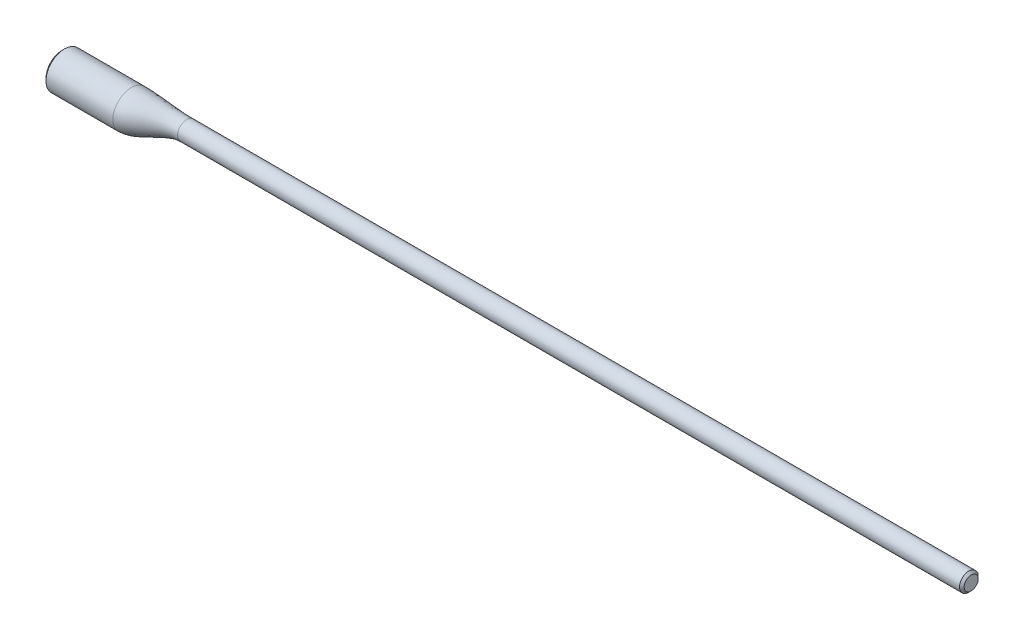
ISO-10303-21;
HEADER;
FILE_DESCRIPTION(('STEP AP214'),'2;1');
FILE_NAME('part.step','',(''),(''),'','','');
FILE_SCHEMA(('AUTOMOTIVE_DESIGN { 1 0 10303 214 1 1 1 1 }'));
ENDSEC;
DATA;
#1=APPLICATION_CONTEXT('core data for automotive mechanical design processes');
#2=APPLICATION_PROTOCOL_DEFINITION('international standard','automotive_design',2000,#1);
#3=PRODUCT_CONTEXT('',#1,'mechanical');
#4=PRODUCT('Part','Part','',(#3));
#5=PRODUCT_RELATED_PRODUCT_CATEGORY('part','',(#4));
#6=PRODUCT_DEFINITION_FORMATION('','',#4);
#7=PRODUCT_DEFINITION_CONTEXT('part definition',#1,'design');
#8=PRODUCT_DEFINITION('design','',#6,#7);
#9=PRODUCT_DEFINITION_SHAPE('','',#8);
#10=(LENGTH_UNIT() NAMED_UNIT(*) SI_UNIT(.MILLI.,.METRE.));
#11=(NAMED_UNIT(*) PLANE_ANGLE_UNIT() SI_UNIT($,.RADIAN.));
#12=(NAMED_UNIT(*) SI_UNIT($,.STERADIAN.) SOLID_ANGLE_UNIT());
#13=UNCERTAINTY_MEASURE_WITH_UNIT(LENGTH_MEASURE(1.E-05),#10,'distance_accuracy_value','');
#14=(GEOMETRIC_REPRESENTATION_CONTEXT(3) GLOBAL_UNCERTAINTY_ASSIGNED_CONTEXT((#13)) GLOBAL_UNIT_ASSIGNED_CONTEXT((#10,
#11,#12)) REPRESENTATION_CONTEXT('',''));
#15=CARTESIAN_POINT('',(0.,0.,0.));
#16=DIRECTION('',(0.,0.,1.));
#17=DIRECTION('',(1.,0.,0.));
#18=AXIS2_PLACEMENT_3D('',#15,#16,#17);
#19=CARTESIAN_POINT('',(180.,-1.28557521937308,0.467911113762047));
#20=DIRECTION('',(0.,0.642787609686541,0.766044443118976));
#21=DIRECTION('',(0.,-0.766044443118977,0.642787609686541));
#22=AXIS2_PLACEMENT_3D('',#19,#20,#21);
#23=PLANE('',#22);
#24=DIRECTION('',(-1.,0.,0.));
#25=VECTOR('',#24,1.);
#26=CARTESIAN_POINT('',(180.,-0.727940468532405,0.));
#27=LINE('',#26,#25);
#28=CARTESIAN_POINT('',(179.5,-0.727940468532405,0.));
#29=VERTEX_POINT('',#28);
#30=CARTESIAN_POINT('',(10.,-0.727940468532405,0.));
#31=VERTEX_POINT('',#30);
#32=EDGE_CURVE('E500',#29,#31,#27,.T.);
#33=ORIENTED_EDGE('',*,*,#32,.F.);
#34=DIRECTION('',(0.,-0.766044443118977,0.642787609686541));
#35=VECTOR('',#34,1.);
#36=CARTESIAN_POINT('',(179.5,-1.28557521937308,0.467911113762048));
#37=LINE('',#36,#35);
#38=CARTESIAN_POINT('',(179.5,-1.28557521937308,0.467911113762048));
#39=VERTEX_POINT('',#38);
#40=EDGE_CURVE('E258',#29,#39,#37,.T.);
#41=ORIENTED_EDGE('',*,*,#40,.T.);
#42=DIRECTION('',(-1.,0.,0.));
#43=VECTOR('',#42,1.);
#44=CARTESIAN_POINT('',(180.,-1.28557521937308,0.467911113762048));
#45=LINE('',#44,#43);
#46=CARTESIAN_POINT('',(10.,-1.28557521937308,0.467911113762048));
#47=VERTEX_POINT('',#46);
#48=EDGE_CURVE('E254',#39,#47,#45,.T.);
#49=ORIENTED_EDGE('',*,*,#48,.T.);
#50=DIRECTION('',(0.,0.766044443118977,-0.642787609686541));
#51=VECTOR('',#50,1.);
#52=CARTESIAN_POINT('',(10.,-1.28557521937308,0.467911113762048));
#53=LINE('',#52,#51);
#54=EDGE_CURVE('E259',#47,#31,#53,.T.);
#55=ORIENTED_EDGE('',*,*,#54,.T.);
#56=EDGE_LOOP('',(#33,#41,#49,#55));
#57=FACE_BOUND('',#56,.T.);
#58=ADVANCED_FACE('F158',(#57),#23,.F.);
#59=CARTESIAN_POINT('',(180.,-0.727940468532405,0.));
#60=DIRECTION('',(0.,0.,1.));
#61=DIRECTION('',(1.,0.,0.));
#62=AXIS2_PLACEMENT_3D('',#59,#60,#61);
#63=PLANE('',#62);
#64=DIRECTION('',(-1.,0.,0.));
#65=VECTOR('',#64,1.);
#66=CARTESIAN_POINT('',(180.,0.727940468532405,0.));
#67=LINE('',#66,#65);
#68=CARTESIAN_POINT('',(179.5,0.727940468532405,0.));
#69=VERTEX_POINT('',#68);
#70=CARTESIAN_POINT('',(10.,0.727940468532405,0.));
#71=VERTEX_POINT('',#70);
#72=EDGE_CURVE('E509',#69,#71,#67,.T.);
#73=ORIENTED_EDGE('',*,*,#72,.F.);
#74=DIRECTION('',(0.,-1.,0.));
#75=VECTOR('',#74,1.);
#76=CARTESIAN_POINT('',(179.5,-0.727940468532405,0.));
#77=LINE('',#76,#75);
#78=EDGE_CURVE('E528',#69,#29,#77,.T.);
#79=ORIENTED_EDGE('',*,*,#78,.T.);
#80=ORIENTED_EDGE('',*,*,#32,.T.);
#81=CARTESIAN_POINT('',(10.,-0.727940468532405,0.));
#82=CARTESIAN_POINT('',(6.6578467133078,-0.727940468532405,0.));
#83=CARTESIAN_POINT('',(3.3421532866922,-1.45588093706482,0.));
#84=CARTESIAN_POINT('',(0.,-1.45588093706482,0.));
#85=B_SPLINE_CURVE_WITH_KNOTS('',3,(#81,#82,#83,#84),.UNSPECIFIED.,.F.,.F.,(4,4),(0.,1.),.UNSPECIFIED.);
#86=CARTESIAN_POINT('',(0.,-1.45588093706482,0.));
#87=VERTEX_POINT('',#86);
#88=EDGE_CURVE('E278',#87,#31,#85,.F.);
#89=ORIENTED_EDGE('',*,*,#88,.F.);
#90=DIRECTION('',(1.,0.,0.));
#91=VECTOR('',#90,1.);
#92=CARTESIAN_POINT('',(-15.,-1.45588093706482,0.));
#93=LINE('',#92,#91);
#94=CARTESIAN_POINT('',(-14.5,-1.45588093706482,0.));
#95=VERTEX_POINT('',#94);
#96=EDGE_CURVE('E435',#95,#87,#93,.T.);
#97=ORIENTED_EDGE('',*,*,#96,.F.);
#98=DIRECTION('',(0.,1.,0.));
#99=VECTOR('',#98,1.);
#100=CARTESIAN_POINT('',(-14.5,1.45588093706482,0.));
#101=LINE('',#100,#99);
#102=CARTESIAN_POINT('',(-14.5,1.45588093706482,0.));
#103=VERTEX_POINT('',#102);
#104=EDGE_CURVE('E474',#95,#103,#101,.T.);
#105=ORIENTED_EDGE('',*,*,#104,.T.);
#106=DIRECTION('',(1.,0.,0.));
#107=VECTOR('',#106,1.);
#108=CARTESIAN_POINT('',(-15.,1.45588093706482,0.));
#109=LINE('',#108,#107);
#110=CARTESIAN_POINT('',(0.,1.45588093706482,0.));
#111=VERTEX_POINT('',#110);
#112=EDGE_CURVE('E266',#103,#111,#109,.T.);
#113=ORIENTED_EDGE('',*,*,#112,.T.);
#114=CARTESIAN_POINT('',(10.,0.727940468532405,0.));
#115=CARTESIAN_POINT('',(6.6578467133078,0.727940468532405,0.));
#116=CARTESIAN_POINT('',(3.3421532866922,1.45588093706482,0.));
#117=CARTESIAN_POINT('',(0.,1.45588093706482,0.));
#118=B_SPLINE_CURVE_WITH_KNOTS('',3,(#114,#115,#116,#117),.UNSPECIFIED.,.F.,.F.,(4,4),(0.,1.),.UNSPECIFIED.);
#119=EDGE_CURVE('E488',#71,#111,#118,.T.);
#120=ORIENTED_EDGE('',*,*,#119,.F.);
#121=EDGE_LOOP('',(#73,#79,#80,#89,#97,#105,#113,#120));
#122=FACE_BOUND('',#121,.T.);
#123=ADVANCED_FACE('F314',(#122),#63,.F.);
#124=CARTESIAN_POINT('',(180.,0.727940468532405,0.));
#125=DIRECTION('',(0.,-0.642787609686541,0.766044443118976));
#126=DIRECTION('',(0.,-0.766044443118976,-0.642787609686541));
#127=AXIS2_PLACEMENT_3D('',#124,#125,#126);
#128=PLANE('',#127);
#129=DIRECTION('',(-1.,0.,0.));
#130=VECTOR('',#129,1.);
#131=CARTESIAN_POINT('',(180.,1.28557521937308,0.467911113762047));
#132=LINE('',#131,#130);
#133=CARTESIAN_POINT('',(179.5,1.28557521937308,0.467911113762047));
#134=VERTEX_POINT('',#133);
#135=CARTESIAN_POINT('',(10.0000000000001,1.28557521937308,0.467911113762047));
#136=VERTEX_POINT('',#135);
#137=EDGE_CURVE('E264',#134,#136,#132,.T.);
#138=ORIENTED_EDGE('',*,*,#137,.F.);
#139=DIRECTION('',(0.,-0.766044443118976,-0.642787609686541));
#140=VECTOR('',#139,1.);
#141=CARTESIAN_POINT('',(179.5,0.727940468532405,0.));
#142=LINE('',#141,#140);
#143=EDGE_CURVE('E525',#134,#69,#142,.T.);
#144=ORIENTED_EDGE('',*,*,#143,.T.);
#145=ORIENTED_EDGE('',*,*,#72,.T.);
#146=DIRECTION('',(0.,0.766044443118976,0.642787609686541));
#147=VECTOR('',#146,1.);
#148=CARTESIAN_POINT('',(10.,0.727940468532405,0.));
#149=LINE('',#148,#147);
#150=EDGE_CURVE('E283',#71,#136,#149,.T.);
#151=ORIENTED_EDGE('',*,*,#150,.T.);
#152=EDGE_LOOP('',(#138,#144,#145,#151));
#153=FACE_BOUND('',#152,.T.);
#154=ADVANCED_FACE('F309',(#153),#128,.F.);
#155=CARTESIAN_POINT('',(180.,0.,2.));
#156=DIRECTION('',(-1.,0.,0.));
#157=DIRECTION('',(0.,0.,1.));
#158=AXIS2_PLACEMENT_3D('',#155,#156,#157);
#159=CYLINDRICAL_SURFACE('',#158,2.);
#160=ORIENTED_EDGE('',*,*,#48,.F.);
#161=CARTESIAN_POINT('',(179.5,0.,2.));
#162=DIRECTION('',(1.,0.,0.));
#163=DIRECTION('',(0.,0.,-1.));
#164=AXIS2_PLACEMENT_3D('',#161,#162,#163);
#165=CIRCLE('',#164,2.);
#166=EDGE_CURVE('E510',#39,#134,#165,.F.);
#167=ORIENTED_EDGE('',*,*,#166,.T.);
#168=ORIENTED_EDGE('',*,*,#137,.T.);
#169=CARTESIAN_POINT('',(10.,0.,2.));
#170=DIRECTION('',(1.,0.,0.));
#171=DIRECTION('',(0.,0.,-1.));
#172=AXIS2_PLACEMENT_3D('',#169,#170,#171);
#173=CIRCLE('',#172,2.);
#174=EDGE_CURVE('E274',#136,#47,#173,.T.);
#175=ORIENTED_EDGE('',*,*,#174,.T.);
#176=EDGE_LOOP('',(#160,#167,#168,#175));
#177=FACE_BOUND('',#176,.T.);
#178=ADVANCED_FACE('F287',(#177),#159,.T.);
#179=CARTESIAN_POINT('',(180.,0.,2.));
#180=DIRECTION('',(1.,0.,0.));
#181=DIRECTION('',(0.,0.,-1.));
#182=AXIS2_PLACEMENT_3D('',#179,#180,#181);
#183=PLANE('',#182);
#184=DIRECTION('',(0.,0.766044443118976,0.642787609686541));
#185=VECTOR('',#184,1.);
#186=CARTESIAN_POINT('',(180.,0.964181414529798,0.850933335321548));
#187=LINE('',#186,#185);
#188=CARTESIAN_POINT('',(180.,0.545955351399297,0.500000000000017));
#189=VERTEX_POINT('',#188);
#190=CARTESIAN_POINT('',(180.,0.964181414529799,0.850933335321548));
#191=VERTEX_POINT('',#190);
#192=EDGE_CURVE('E499',#189,#191,#187,.T.);
#193=ORIENTED_EDGE('',*,*,#192,.T.);
#194=CARTESIAN_POINT('',(180.,0.,2.));
#195=DIRECTION('',(1.,0.,0.));
#196=DIRECTION('',(0.,0.,-1.));
#197=AXIS2_PLACEMENT_3D('',#194,#195,#196);
#198=CIRCLE('',#197,1.49999999999998);
#199=CARTESIAN_POINT('',(180.,-0.964181414529799,0.85093333532155));
#200=VERTEX_POINT('',#199);
#201=EDGE_CURVE('E503',#191,#200,#198,.T.);
#202=ORIENTED_EDGE('',*,*,#201,.T.);
#203=DIRECTION('',(0.,0.766044443118977,-0.642787609686541));
#204=VECTOR('',#203,1.);
#205=CARTESIAN_POINT('',(180.,-0.406546663689123,0.383022221559501));
#206=LINE('',#205,#204);
#207=CARTESIAN_POINT('',(180.,-0.545955351399296,0.500000000000017));
#208=VERTEX_POINT('',#207);
#209=EDGE_CURVE('E491',#200,#208,#206,.T.);
#210=ORIENTED_EDGE('',*,*,#209,.T.);
#211=DIRECTION('',(0.,1.,0.));
#212=VECTOR('',#211,1.);
#213=CARTESIAN_POINT('',(180.,0.727940468532405,0.500000000000017));
#214=LINE('',#213,#212);
#215=EDGE_CURVE('E496',#208,#189,#214,.T.);
#216=ORIENTED_EDGE('',*,*,#215,.T.);
#217=EDGE_LOOP('',(#193,#202,#210,#216));
#218=FACE_BOUND('',#217,.T.);
#219=ADVANCED_FACE('F307',(#218),#183,.T.);
#220=CARTESIAN_POINT('',(-15.,2.57115043874617,0.935822227524095));
#221=DIRECTION('',(0.,-0.642787609686542,0.766044443118976));
#222=DIRECTION('',(0.,-0.766044443118976,-0.642787609686542));
#223=AXIS2_PLACEMENT_3D('',#220,#221,#222);
#224=PLANE('',#223);
#225=ORIENTED_EDGE('',*,*,#112,.F.);
#226=DIRECTION('',(0.,0.766044443118976,0.642787609686542));
#227=VECTOR('',#226,1.);
#228=CARTESIAN_POINT('',(-14.5,2.57115043874617,0.935822227524096));
#229=LINE('',#228,#227);
#230=CARTESIAN_POINT('',(-14.5,2.57115043874617,0.935822227524095));
#231=VERTEX_POINT('',#230);
#232=EDGE_CURVE('E12',#103,#231,#229,.T.);
#233=ORIENTED_EDGE('',*,*,#232,.T.);
#234=DIRECTION('',(1.,0.,0.));
#235=VECTOR('',#234,1.);
#236=CARTESIAN_POINT('',(-15.,2.57115043874617,0.935822227524095));
#237=LINE('',#236,#235);
#238=CARTESIAN_POINT('',(0.,2.57115043874617,0.935822227524095));
#239=VERTEX_POINT('',#238);
#240=EDGE_CURVE('E433',#231,#239,#237,.T.);
#241=ORIENTED_EDGE('',*,*,#240,.T.);
#242=DIRECTION('',(0.,-0.766044443118976,-0.642787609686542));
#243=VECTOR('',#242,1.);
#244=CARTESIAN_POINT('',(0.,2.57115043874617,0.935822227524095));
#245=LINE('',#244,#243);
#246=EDGE_CURVE('E467',#239,#111,#245,.T.);
#247=ORIENTED_EDGE('',*,*,#246,.T.);
#248=EDGE_LOOP('',(#225,#233,#241,#247));
#249=FACE_BOUND('',#248,.T.);
#250=ADVANCED_FACE('F456',(#249),#224,.F.);
#251=CARTESIAN_POINT('',(-15.,-1.45588093706482,0.));
#252=DIRECTION('',(0.,0.642787609686542,0.766044443118976));
#253=DIRECTION('',(0.,-0.766044443118976,0.642787609686542));
#254=AXIS2_PLACEMENT_3D('',#251,#252,#253);
#255=PLANE('',#254);
#256=DIRECTION('',(1.,0.,0.));
#257=VECTOR('',#256,1.);
#258=CARTESIAN_POINT('',(-15.,-2.57115043874617,0.935822227524095));
#259=LINE('',#258,#257);
#260=CARTESIAN_POINT('',(-14.5,-2.57115043874617,0.935822227524095));
#261=VERTEX_POINT('',#260);
#262=CARTESIAN_POINT('',(0.,-2.57115043874617,0.935822227524095));
#263=VERTEX_POINT('',#262);
#264=EDGE_CURVE('E429',#261,#263,#259,.T.);
#265=ORIENTED_EDGE('',*,*,#264,.F.);
#266=DIRECTION('',(0.,0.766044443118976,-0.642787609686542));
#267=VECTOR('',#266,1.);
#268=CARTESIAN_POINT('',(-14.5,-1.45588093706482,0.));
#269=LINE('',#268,#267);
#270=EDGE_CURVE('E167',#261,#95,#269,.T.);
#271=ORIENTED_EDGE('',*,*,#270,.T.);
#272=ORIENTED_EDGE('',*,*,#96,.T.);
#273=DIRECTION('',(0.,-0.766044443118976,0.642787609686542));
#274=VECTOR('',#273,1.);
#275=CARTESIAN_POINT('',(0.,-1.45588093706482,0.));
#276=LINE('',#275,#274);
#277=EDGE_CURVE('E479',#87,#263,#276,.T.);
#278=ORIENTED_EDGE('',*,*,#277,.T.);
#279=EDGE_LOOP('',(#265,#271,#272,#278));
#280=FACE_BOUND('',#279,.T.);
#281=ADVANCED_FACE('F453',(#280),#255,.F.);
#282=CARTESIAN_POINT('',(-15.,0.,4.));
#283=DIRECTION('',(1.,0.,0.));
#284=DIRECTION('',(0.,0.,-1.));
#285=AXIS2_PLACEMENT_3D('',#282,#283,#284);
#286=CYLINDRICAL_SURFACE('',#285,4.);
#287=ORIENTED_EDGE('',*,*,#240,.F.);
#288=CARTESIAN_POINT('',(-14.5,0.,4.));
#289=DIRECTION('',(-1.,0.,0.));
#290=DIRECTION('',(0.,0.,1.));
#291=AXIS2_PLACEMENT_3D('',#288,#289,#290);
#292=CIRCLE('',#291,4.);
#293=EDGE_CURVE('E424',#231,#261,#292,.F.);
#294=ORIENTED_EDGE('',*,*,#293,.T.);
#295=ORIENTED_EDGE('',*,*,#264,.T.);
#296=CARTESIAN_POINT('',(0.,1.45588093706482,0.));
#297=CARTESIAN_POINT('',(0.,1.54882006220493,0.0779851856270084));
#298=CARTESIAN_POINT('',(0.,1.73469831248515,0.233955556881025));
#299=CARTESIAN_POINT('',(0.,2.01351568790549,0.467911113762048));
#300=CARTESIAN_POINT('',(0.,2.29233306332583,0.701866670643072));
#301=CARTESIAN_POINT('',(0.,2.47821131360605,0.857837041897087));
#302=CARTESIAN_POINT('',(0.,2.88311705075017,1.19759329659628));
#303=CARTESIAN_POINT('',(0.,3.42494230375342,1.81750567178898));
#304=CARTESIAN_POINT('',(0.,4.09345487548263,3.32497957238402));
#305=CARTESIAN_POINT('',(0.,4.00097886537138,5.45588692398781));
#306=CARTESIAN_POINT('',(0.,2.4418978116345,7.48757836550999));
#307=CARTESIAN_POINT('',(0.,0.,8.25733863000625));
#308=CARTESIAN_POINT('',(0.,-2.44189781163452,7.48757836550999));
#309=CARTESIAN_POINT('',(0.,-4.00097886537135,5.45588692398781));
#310=CARTESIAN_POINT('',(0.,-4.09345487548265,3.32497957238403));
#311=CARTESIAN_POINT('',(0.,-3.42494230375341,1.81750567178898));
#312=CARTESIAN_POINT('',(0.,-2.88311705075017,1.19759329659628));
#313=CARTESIAN_POINT('',(0.,-2.47821131360605,0.857837041897087));
#314=CARTESIAN_POINT('',(0.,-2.29233306332583,0.701866670643071));
#315=CARTESIAN_POINT('',(0.,-2.01351568790549,0.467911113762047));
#316=CARTESIAN_POINT('',(0.,-1.73469831248516,0.233955556881024));
#317=CARTESIAN_POINT('',(0.,-1.54882006220493,0.077985185627008));
#318=CARTESIAN_POINT('',(0.,-1.45588093706482,0.));
#319=B_SPLINE_CURVE_WITH_KNOTS('',3,(#296,#297,#298,#299,#300,#301,#302,#303,#304,#305,#306,
#307,#308,#309,#310,#311,#312,#313,#314,#315,#316,#317,#318),.UNSPECIFIED.,.F.,.F.,(4,1,1,1,2,1,
1,1,1,1,1,1,1,1,2,1,1,1,4),(0.,0.0162056614220876,0.032411322844175,0.0486169842662625,
0.0648226456883501,0.119219814977306,0.173616984266262,0.282411322844175,0.391205661422088,0.5,
0.608794338577912,0.717588677155825,0.826383015733737,0.880780185022694,0.93517735431165,
0.951383015733737,0.967588677155825,0.983794338577912,1.),.UNSPECIFIED.);
#320=EDGE_CURVE('E482',#263,#239,#319,.F.);
#321=ORIENTED_EDGE('',*,*,#320,.T.);
#322=EDGE_LOOP('',(#287,#294,#295,#321));
#323=FACE_BOUND('',#322,.T.);
#324=ADVANCED_FACE('F442',(#323),#286,.T.);
#325=CARTESIAN_POINT('',(-15.,0.,4.));
#326=DIRECTION('',(-1.,0.,0.));
#327=DIRECTION('',(0.,0.,1.));
#328=AXIS2_PLACEMENT_3D('',#325,#326,#327);
#329=PLANE('',#328);
#330=DIRECTION('',(0.,-0.766044443118976,0.642787609686542));
#331=VECTOR('',#330,1.);
#332=CARTESIAN_POINT('',(-15.,-2.24975663390293,1.31884444908354));
#333=LINE('',#332,#331);
#334=CARTESIAN_POINT('',(-15.,-1.27389581993173,0.499999999999948));
#335=VERTEX_POINT('',#334);
#336=CARTESIAN_POINT('',(-15.,-2.24975663390293,1.31884444908354));
#337=VERTEX_POINT('',#336);
#338=EDGE_CURVE('E395',#335,#337,#333,.T.);
#339=ORIENTED_EDGE('',*,*,#338,.T.);
#340=CARTESIAN_POINT('',(-15.,0.,4.));
#341=DIRECTION('',(-1.,0.,0.));
#342=DIRECTION('',(0.,0.,1.));
#343=AXIS2_PLACEMENT_3D('',#340,#341,#342);
#344=CIRCLE('',#343,3.50000000000005);
#345=CARTESIAN_POINT('',(-15.,2.24975663390293,1.31884444908354));
#346=VERTEX_POINT('',#345);
#347=EDGE_CURVE('E426',#337,#346,#344,.T.);
#348=ORIENTED_EDGE('',*,*,#347,.T.);
#349=DIRECTION('',(0.,-0.766044443118976,-0.642787609686542));
#350=VECTOR('',#349,1.);
#351=CARTESIAN_POINT('',(-15.,1.13448713222158,0.383022221559448));
#352=LINE('',#351,#350);
#353=CARTESIAN_POINT('',(-15.,1.27389581993173,0.499999999999948));
#354=VERTEX_POINT('',#353);
#355=EDGE_CURVE('E473',#346,#354,#352,.T.);
#356=ORIENTED_EDGE('',*,*,#355,.T.);
#357=DIRECTION('',(0.,-1.,0.));
#358=VECTOR('',#357,1.);
#359=CARTESIAN_POINT('',(-15.,-1.45588093706482,0.499999999999948));
#360=LINE('',#359,#358);
#361=EDGE_CURVE('E471',#354,#335,#360,.T.);
#362=ORIENTED_EDGE('',*,*,#361,.T.);
#363=EDGE_LOOP('',(#339,#348,#356,#362));
#364=FACE_BOUND('',#363,.T.);
#365=ADVANCED_FACE('F455',(#364),#329,.T.);
#366=CARTESIAN_POINT('',(10.,-0.727940468532405,0.));
#367=CARTESIAN_POINT('',(6.6578467133078,-0.727940468532405,0.));
#368=CARTESIAN_POINT('',(3.3421532866922,-1.45588093706482,0.));
#369=CARTESIAN_POINT('',(0.,-1.45588093706482,0.));
#370=CARTESIAN_POINT('',(10.,-0.774410031102461,0.0389925928135041));
#371=CARTESIAN_POINT('',(6.65661668693848,-0.774410031102461,0.0389925928135041));
#372=CARTESIAN_POINT('',(3.34338331306153,-1.54882006220493,0.077985185627008));
#373=CARTESIAN_POINT('',(0.,-1.54882006220493,0.077985185627008));
#374=CARTESIAN_POINT('',(10.,-0.867349156242575,0.116977778440512));
#375=CARTESIAN_POINT('',(6.65415663419982,-0.867349156242575,0.116977778440512));
#376=CARTESIAN_POINT('',(3.34584336580019,-1.73469831248515,0.233955556881024));
#377=CARTESIAN_POINT('',(0.,-1.73469831248516,0.233955556881024));
#378=CARTESIAN_POINT('',(10.,-1.00675784395274,0.233955556881024));
#379=CARTESIAN_POINT('',(6.6490750355602,-1.00675784395274,0.233955556881024));
#380=CARTESIAN_POINT('',(3.3509249644398,-2.01351568790549,0.467911113762047));
#381=CARTESIAN_POINT('',(0.,-2.01351568790549,0.467911113762047));
#382=CARTESIAN_POINT('',(10.,-1.14616653166291,0.350933335321536));
#383=CARTESIAN_POINT('',(6.64299736814644,-1.14616653166291,0.350933335321536));
#384=CARTESIAN_POINT('',(3.35700263185357,-2.29233306332583,0.701866670643072));
#385=CARTESIAN_POINT('',(0.,-2.29233306332583,0.701866670643071));
#386=CARTESIAN_POINT('',(10.,-1.23910565680302,0.428918520948544));
#387=CARTESIAN_POINT('',(6.63817429619333,-1.23910565680302,0.428918520948544));
#388=CARTESIAN_POINT('',(3.36182570380668,-2.47821131360605,0.857837041897087));
#389=CARTESIAN_POINT('',(0.,-2.47821131360605,0.857837041897087));
#390=CARTESIAN_POINT('',(10.,-1.44155852537508,0.598796648298142));
#391=CARTESIAN_POINT('',(6.62703386652991,-1.44155852537508,0.598796648298142));
#392=CARTESIAN_POINT('',(3.3729661334701,-2.88311705075017,1.19759329659628));
#393=CARTESIAN_POINT('',(0.,-2.88311705075017,1.19759329659628));
#394=CARTESIAN_POINT('',(9.99999999999999,-1.71222678129943,0.909411513453149));
#395=CARTESIAN_POINT('',(6.60658712192478,-1.71222678129943,0.909411513453149));
#396=CARTESIAN_POINT('',(3.3934128780752,-3.42494230375341,1.81750567178898));
#397=CARTESIAN_POINT('',(0.,-3.42494230375341,1.81750567178898));
#398=CARTESIAN_POINT('',(9.99999999999998,-2.04695818154675,1.66188115126264));
#399=CARTESIAN_POINT('',(6.55738864332492,-2.04695818154675,1.66188115126264));
#400=CARTESIAN_POINT('',(3.44261135667506,-4.09345487548265,3.32497957238403));
#401=CARTESIAN_POINT('',(0.,-4.09345487548265,3.32497957238403));
#402=CARTESIAN_POINT('',(10.,-2.00034093394808,2.72828938102637));
#403=CARTESIAN_POINT('',(6.48921785599439,-2.00034093394808,2.72828938102637));
#404=CARTESIAN_POINT('',(3.51078214400564,-4.00097886537135,5.45588692398781));
#405=CARTESIAN_POINT('',(0.,-4.00097886537135,5.45588692398781));
#406=CARTESIAN_POINT('',(9.99999999999997,-1.22099565928668,3.7436730401692));
#407=CARTESIAN_POINT('',(6.42566683012112,-1.22099565928668,3.7436730401692));
#408=CARTESIAN_POINT('',(3.57433316987886,-2.44189781163452,7.48757836550999));
#409=CARTESIAN_POINT('',(0.,-2.44189781163452,7.48757836550999));
#410=CARTESIAN_POINT('',(10.,0.,4.12880799300756));
#411=CARTESIAN_POINT('',(6.40194194473065,0.,4.12880799300756));
#412=CARTESIAN_POINT('',(3.59805805526937,0.,8.25733863000625));
#413=CARTESIAN_POINT('',(0.,0.,8.25733863000625));
#414=CARTESIAN_POINT('',(9.99999999999999,1.22099565928669,3.7436730401692));
#415=CARTESIAN_POINT('',(6.42566683012113,1.22099565928669,3.7436730401692));
#416=CARTESIAN_POINT('',(3.57433316987886,2.4418978116345,7.48757836550999));
#417=CARTESIAN_POINT('',(0.,2.4418978116345,7.48757836550999));
#418=CARTESIAN_POINT('',(9.99999999999999,2.00034093394808,2.72828938102637));
#419=CARTESIAN_POINT('',(6.48921785599437,2.00034093394808,2.72828938102637));
#420=CARTESIAN_POINT('',(3.51078214400563,4.00097886537138,5.45588692398781));
#421=CARTESIAN_POINT('',(0.,4.00097886537138,5.45588692398781));
#422=CARTESIAN_POINT('',(10.,2.04695818154675,1.66188115126263));
#423=CARTESIAN_POINT('',(6.55738864332493,2.04695818154675,1.66188115126263));
#424=CARTESIAN_POINT('',(3.44261135667507,4.09345487548263,3.32497957238402));
#425=CARTESIAN_POINT('',(0.,4.09345487548263,3.32497957238402));
#426=CARTESIAN_POINT('',(10.,1.71222678129943,0.909411513453147));
#427=CARTESIAN_POINT('',(6.60658712192481,1.71222678129943,0.909411513453147));
#428=CARTESIAN_POINT('',(3.39341287807521,3.42494230375342,1.81750567178898));
#429=CARTESIAN_POINT('',(0.,3.42494230375342,1.81750567178898));
#430=CARTESIAN_POINT('',(10.,1.44155852537508,0.59879664829814));
#431=CARTESIAN_POINT('',(6.62703386652991,1.44155852537508,0.59879664829814));
#432=CARTESIAN_POINT('',(3.37296613347011,2.88311705075017,1.19759329659628));
#433=CARTESIAN_POINT('',(0.,2.88311705075017,1.19759329659628));
#434=CARTESIAN_POINT('',(10.,1.23910565680302,0.428918520948543));
#435=CARTESIAN_POINT('',(6.63817429619333,1.23910565680302,0.428918520948543));
#436=CARTESIAN_POINT('',(3.36182570380668,2.47821131360605,0.857837041897087));
#437=CARTESIAN_POINT('',(0.,2.47821131360605,0.857837041897087));
#438=CARTESIAN_POINT('',(10.,1.14616653166291,0.350933335321535));
#439=CARTESIAN_POINT('',(6.64299736814644,1.14616653166291,0.350933335321535));
#440=CARTESIAN_POINT('',(3.35700263185357,2.29233306332583,0.701866670643072));
#441=CARTESIAN_POINT('',(0.,2.29233306332583,0.701866670643072));
#442=CARTESIAN_POINT('',(10.,1.00675784395274,0.233955556881023));
#443=CARTESIAN_POINT('',(6.64907503556019,1.00675784395274,0.233955556881023));
#444=CARTESIAN_POINT('',(3.3509249644398,2.01351568790549,0.467911113762048));
#445=CARTESIAN_POINT('',(0.,2.01351568790549,0.467911113762048));
#446=CARTESIAN_POINT('',(9.99999999999999,0.867349156242573,0.116977778440512));
#447=CARTESIAN_POINT('',(6.65415663419982,0.867349156242573,0.116977778440512));
#448=CARTESIAN_POINT('',(3.34584336580019,1.73469831248515,0.233955556881025));
#449=CARTESIAN_POINT('',(0.,1.73469831248515,0.233955556881025));
#450=CARTESIAN_POINT('',(10.,0.774410031102461,0.038992592813504));
#451=CARTESIAN_POINT('',(6.65661668693847,0.774410031102461,0.038992592813504));
#452=CARTESIAN_POINT('',(3.34338331306153,1.54882006220493,0.0779851856270084));
#453=CARTESIAN_POINT('',(0.,1.54882006220493,0.0779851856270084));
#454=CARTESIAN_POINT('',(10.,0.727940468532405,0.));
#455=CARTESIAN_POINT('',(6.6578467133078,0.727940468532405,0.));
#456=CARTESIAN_POINT('',(3.3421532866922,1.45588093706482,0.));
#457=CARTESIAN_POINT('',(0.,1.45588093706482,0.));
#458=B_SPLINE_SURFACE_WITH_KNOTS('',3,3,((#366,#367,#368,#369),(#370,#371,#372,#373),(#374,#375,
#376,#377),(#378,#379,#380,#381),(#382,#383,#384,#385),(#386,#387,#388,#389),(#390,#391,#392,
#393),(#394,#395,#396,#397),(#398,#399,#400,#401),(#402,#403,#404,#405),(#406,#407,#408,#409),
(#410,#411,#412,#413),(#414,#415,#416,#417),(#418,#419,#420,#421),(#422,#423,#424,#425),(#426,
#427,#428,#429),(#430,#431,#432,#433),(#434,#435,#436,#437),(#438,#439,#440,#441),(#442,#443,
#444,#445),(#446,#447,#448,#449),(#450,#451,#452,#453),(#454,#455,#456,#457)),.UNSPECIFIED.,.F.,
.F.,.F.,(4,1,1,1,2,1,1,1,1,1,1,1,1,1,2,1,1,1,4),(4,4),(0.,0.0162056614220876,0.0324113228441751,
0.0486169842662627,0.0648226456883502,0.119219814977306,0.173616984266263,0.282411322844175,
0.391205661422088,0.5,0.608794338577912,0.717588677155825,0.826383015733738,0.880780185022694,
0.93517735431165,0.951383015733738,0.967588677155825,0.983794338577912,1.),(0.,1.),.UNSPECIFIED.);
#459=ORIENTED_EDGE('',*,*,#54,.F.);
#460=ORIENTED_EDGE('',*,*,#174,.F.);
#461=ORIENTED_EDGE('',*,*,#150,.F.);
#462=ORIENTED_EDGE('',*,*,#119,.T.);
#463=ORIENTED_EDGE('',*,*,#246,.F.);
#464=ORIENTED_EDGE('',*,*,#320,.F.);
#465=ORIENTED_EDGE('',*,*,#277,.F.);
#466=ORIENTED_EDGE('',*,*,#88,.T.);
#467=EDGE_LOOP('',(#459,#460,#461,#462,#463,#464,#465,#466));
#468=FACE_BOUND('',#467,.T.);
#469=ADVANCED_FACE('F275',(#468),#458,.T.);
#470=CARTESIAN_POINT('',(180.,0.,0.500000000000017));
#471=DIRECTION('',(0.707106781186539,0.,-0.707106781186556));
#472=DIRECTION('',(0.,-1.,0.));
#473=AXIS2_PLACEMENT_3D('',#470,#471,#472);
#474=PLANE('',#473);
#475=DIRECTION('',(0.684791078771744,0.249243569363953,0.684791078771728));
#476=VECTOR('',#475,1.);
#477=CARTESIAN_POINT('',(180.093183535304,-0.512039318224973,0.593183535303941));
#478=LINE('',#477,#476);
#479=EDGE_CURVE('E419',#29,#208,#478,.T.);
#480=ORIENTED_EDGE('',*,*,#479,.F.);
#481=ORIENTED_EDGE('',*,*,#78,.F.);
#482=DIRECTION('',(0.684791078771744,-0.249243569363953,0.684791078771728));
#483=VECTOR('',#482,1.);
#484=CARTESIAN_POINT('',(180.093183535304,0.512039318224975,0.59318353530394));
#485=LINE('',#484,#483);
#486=EDGE_CURVE('E285',#189,#69,#485,.F.);
#487=ORIENTED_EDGE('',*,*,#486,.F.);
#488=ORIENTED_EDGE('',*,*,#215,.F.);
#489=EDGE_LOOP('',(#480,#481,#487,#488));
#490=FACE_BOUND('',#489,.T.);
#491=ADVANCED_FACE('F359',(#490),#474,.T.);
#492=CARTESIAN_POINT('',(180.,0.9641814145298,0.85093333532155));
#493=DIRECTION('',(0.707106781186539,0.45451947767205,-0.541675220419707));
#494=DIRECTION('',(0.,-0.766044443118976,-0.642787609686541));
#495=AXIS2_PLACEMENT_3D('',#492,#493,#494);
#496=PLANE('',#495);
#497=ORIENTED_EDGE('',*,*,#486,.T.);
#498=ORIENTED_EDGE('',*,*,#143,.F.);
#499=DIRECTION('',(-0.707106781186556,0.454519477672039,-0.541675220419695));
#500=VECTOR('',#499,1.);
#501=CARTESIAN_POINT('',(180.,0.964181414529799,0.850933335321548));
#502=LINE('',#501,#500);
#503=EDGE_CURVE('E402',#191,#134,#502,.T.);
#504=ORIENTED_EDGE('',*,*,#503,.F.);
#505=ORIENTED_EDGE('',*,*,#192,.F.);
#506=EDGE_LOOP('',(#497,#498,#504,#505));
#507=FACE_BOUND('',#506,.T.);
#508=ADVANCED_FACE('F354',(#507),#496,.T.);
#509=CARTESIAN_POINT('',(180.,-0.9641814145298,0.85093333532155));
#510=DIRECTION('',(0.70710678118654,-0.45451947767205,-0.541675220419707));
#511=DIRECTION('',(0.,-0.766044443118977,0.642787609686541));
#512=AXIS2_PLACEMENT_3D('',#509,#510,#511);
#513=PLANE('',#512);
#514=ORIENTED_EDGE('',*,*,#479,.T.);
#515=ORIENTED_EDGE('',*,*,#209,.F.);
#516=DIRECTION('',(0.707106781186555,0.45451947767204,0.541675220419695));
#517=VECTOR('',#516,1.);
#518=CARTESIAN_POINT('',(179.5,-1.28557521937308,0.467911113762048));
#519=LINE('',#518,#517);
#520=EDGE_CURVE('E396',#39,#200,#519,.T.);
#521=ORIENTED_EDGE('',*,*,#520,.F.);
#522=ORIENTED_EDGE('',*,*,#40,.F.);
#523=EDGE_LOOP('',(#514,#515,#521,#522));
#524=FACE_BOUND('',#523,.T.);
#525=ADVANCED_FACE('F348',(#524),#513,.T.);
#526=CARTESIAN_POINT('',(180.,0.,2.));
#527=DIRECTION('',(-1.,0.,0.));
#528=DIRECTION('',(0.,0.,1.));
#529=AXIS2_PLACEMENT_3D('',#526,#527,#528);
#530=CONICAL_SURFACE('',#529,1.49999999999998,0.785398163397437);
#531=ORIENTED_EDGE('',*,*,#503,.T.);
#532=ORIENTED_EDGE('',*,*,#166,.F.);
#533=ORIENTED_EDGE('',*,*,#520,.T.);
#534=ORIENTED_EDGE('',*,*,#201,.F.);
#535=EDGE_LOOP('',(#531,#532,#533,#534));
#536=FACE_BOUND('',#535,.T.);
#537=ADVANCED_FACE('F338',(#536),#530,.T.);
#538=CARTESIAN_POINT('',(-15.,0.,0.499999999999948));
#539=DIRECTION('',(-0.70710678118652,0.,-0.707106781186575));
#540=DIRECTION('',(0.,1.,0.));
#541=AXIS2_PLACEMENT_3D('',#538,#539,#540);
#542=PLANE('',#541);
#543=DIRECTION('',(-0.684791078771759,-0.249243569363975,0.684791078771705));
#544=VECTOR('',#543,1.);
#545=CARTESIAN_POINT('',(-15.2174282490425,1.19475840919165,0.717428249042408));
#546=LINE('',#545,#544);
#547=EDGE_CURVE('E397',#103,#354,#546,.T.);
#548=ORIENTED_EDGE('',*,*,#547,.F.);
#549=ORIENTED_EDGE('',*,*,#104,.F.);
#550=DIRECTION('',(-0.684791078771759,0.249243569363973,0.684791078771706));
#551=VECTOR('',#550,1.);
#552=CARTESIAN_POINT('',(-15.2174282490425,-1.19475840919163,0.717428249042453));
#553=LINE('',#552,#551);
#554=EDGE_CURVE('E165',#335,#95,#553,.F.);
#555=ORIENTED_EDGE('',*,*,#554,.F.);
#556=ORIENTED_EDGE('',*,*,#361,.F.);
#557=EDGE_LOOP('',(#548,#549,#555,#556));
#558=FACE_BOUND('',#557,.T.);
#559=ADVANCED_FACE('F162',(#558),#542,.T.);
#560=CARTESIAN_POINT('',(-15.,-2.24975663390293,1.31884444908354));
#561=DIRECTION('',(-0.707106781186529,-0.454519477672057,-0.541675220419714));
#562=DIRECTION('',(0.,0.766044443118976,-0.642787609686542));
#563=AXIS2_PLACEMENT_3D('',#560,#561,#562);
#564=PLANE('',#563);
#565=ORIENTED_EDGE('',*,*,#554,.T.);
#566=ORIENTED_EDGE('',*,*,#270,.F.);
#567=DIRECTION('',(0.707106781186566,-0.454519477672033,-0.541675220419687));
#568=VECTOR('',#567,1.);
#569=CARTESIAN_POINT('',(-15.,-2.24975663390293,1.31884444908354));
#570=LINE('',#569,#568);
#571=EDGE_CURVE('E178',#337,#261,#570,.T.);
#572=ORIENTED_EDGE('',*,*,#571,.F.);
#573=ORIENTED_EDGE('',*,*,#338,.F.);
#574=EDGE_LOOP('',(#565,#566,#572,#573));
#575=FACE_BOUND('',#574,.T.);
#576=ADVANCED_FACE('F378',(#575),#564,.T.);
#577=CARTESIAN_POINT('',(-15.,2.24975663390293,1.31884444908354));
#578=DIRECTION('',(-0.70710678118653,0.454519477672057,-0.541675220419714));
#579=DIRECTION('',(0.,0.766044443118976,0.642787609686542));
#580=AXIS2_PLACEMENT_3D('',#577,#578,#579);
#581=PLANE('',#580);
#582=ORIENTED_EDGE('',*,*,#547,.T.);
#583=ORIENTED_EDGE('',*,*,#355,.F.);
#584=DIRECTION('',(-0.707106781186565,-0.454519477672034,0.541675220419687));
#585=VECTOR('',#584,1.);
#586=CARTESIAN_POINT('',(-14.5,2.57115043874617,0.935822227524096));
#587=LINE('',#586,#585);
#588=EDGE_CURVE('E407',#231,#346,#587,.T.);
#589=ORIENTED_EDGE('',*,*,#588,.F.);
#590=ORIENTED_EDGE('',*,*,#232,.F.);
#591=EDGE_LOOP('',(#582,#583,#589,#590));
#592=FACE_BOUND('',#591,.T.);
#593=ADVANCED_FACE('F372',(#592),#581,.T.);
#594=CARTESIAN_POINT('',(-15.,0.,4.));
#595=DIRECTION('',(1.,0.,0.));
#596=DIRECTION('',(0.,0.,-1.));
#597=AXIS2_PLACEMENT_3D('',#594,#595,#596);
#598=CONICAL_SURFACE('',#597,3.50000000000005,0.785398163397423);
#599=ORIENTED_EDGE('',*,*,#571,.T.);
#600=ORIENTED_EDGE('',*,*,#293,.F.);
#601=ORIENTED_EDGE('',*,*,#588,.T.);
#602=ORIENTED_EDGE('',*,*,#347,.F.);
#603=EDGE_LOOP('',(#599,#600,#601,#602));
#604=FACE_BOUND('',#603,.T.);
#605=ADVANCED_FACE('F368',(#604),#598,.T.);
#606=CLOSED_SHELL('',(#58,#123,#154,#178,#219,#250,#281,#324,#365,#469,#491,#508,#525,#537,#559,
#576,#593,#605));
#607=MANIFOLD_SOLID_BREP('B2',#606);
#608=ADVANCED_BREP_SHAPE_REPRESENTATION('',(#18,#607),#14);
#609=SHAPE_DEFINITION_REPRESENTATION(#9,#608);
ENDSEC;
END-ISO-10303-21;
